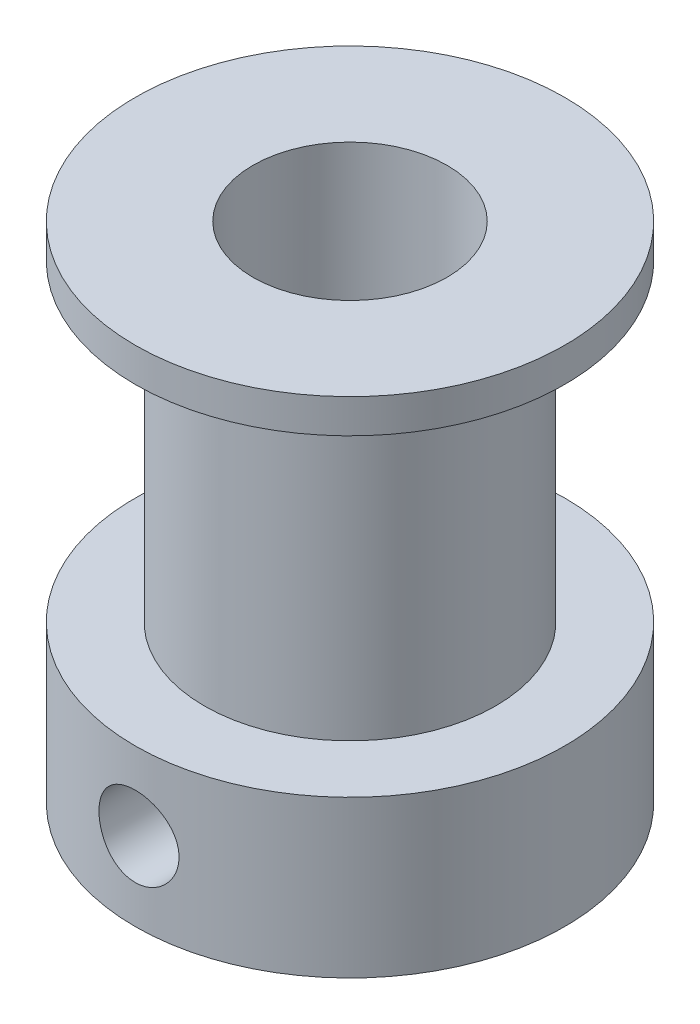
ISO-10303-21;
HEADER;
FILE_DESCRIPTION(('STEP AP214'),'2;1');
FILE_NAME('part.step','',(''),(''),'','','');
FILE_SCHEMA(('AUTOMOTIVE_DESIGN { 1 0 10303 214 1 1 1 1 }'));
ENDSEC;
DATA;
#1=APPLICATION_CONTEXT('core data for automotive mechanical design processes');
#2=APPLICATION_PROTOCOL_DEFINITION('international standard','automotive_design',2000,#1);
#3=PRODUCT_CONTEXT('',#1,'mechanical');
#4=PRODUCT('Part','Part','',(#3));
#5=PRODUCT_RELATED_PRODUCT_CATEGORY('part','',(#4));
#6=PRODUCT_DEFINITION_FORMATION('','',#4);
#7=PRODUCT_DEFINITION_CONTEXT('part definition',#1,'design');
#8=PRODUCT_DEFINITION('design','',#6,#7);
#9=PRODUCT_DEFINITION_SHAPE('','',#8);
#10=(LENGTH_UNIT() NAMED_UNIT(*) SI_UNIT(.MILLI.,.METRE.));
#11=(NAMED_UNIT(*) PLANE_ANGLE_UNIT() SI_UNIT($,.RADIAN.));
#12=(NAMED_UNIT(*) SI_UNIT($,.STERADIAN.) SOLID_ANGLE_UNIT());
#13=UNCERTAINTY_MEASURE_WITH_UNIT(LENGTH_MEASURE(1.E-05),#10,'distance_accuracy_value','');
#14=(GEOMETRIC_REPRESENTATION_CONTEXT(3) GLOBAL_UNCERTAINTY_ASSIGNED_CONTEXT((#13)) GLOBAL_UNIT_ASSIGNED_CONTEXT((#10,
#11,#12)) REPRESENTATION_CONTEXT('',''));
#15=CARTESIAN_POINT('',(0.,0.,0.));
#16=DIRECTION('',(0.,0.,1.));
#17=DIRECTION('',(1.,0.,0.));
#18=AXIS2_PLACEMENT_3D('',#15,#16,#17);
#19=CARTESIAN_POINT('',(0.,6.45,0.));
#20=DIRECTION('',(0.,1.,0.));
#21=DIRECTION('',(0.,0.,1.));
#22=AXIS2_PLACEMENT_3D('',#19,#20,#21);
#23=PLANE('',#22);
#24=CARTESIAN_POINT('',(0.,6.45,0.));
#25=DIRECTION('',(0.,1.,0.));
#26=DIRECTION('',(0.,0.,1.));
#27=AXIS2_PLACEMENT_3D('',#24,#25,#26);
#28=CIRCLE('',#27,8.85);
#29=CARTESIAN_POINT('',(0.,6.45,8.85));
#30=VERTEX_POINT('',#29);
#31=EDGE_CURVE('E10',#30,#30,#28,.T.);
#32=ORIENTED_EDGE('',*,*,#31,.T.);
#33=EDGE_LOOP('',(#32));
#34=FACE_BOUND('',#33,.T.);
#35=CARTESIAN_POINT('',(0.,6.45,0.));
#36=DIRECTION('',(0.,1.,0.));
#37=DIRECTION('',(0.,0.,1.));
#38=AXIS2_PLACEMENT_3D('',#35,#36,#37);
#39=CIRCLE('',#38,6.);
#40=CARTESIAN_POINT('',(0.,6.45,-6.));
#41=VERTEX_POINT('',#40);
#42=EDGE_CURVE('E50',#41,#41,#39,.T.);
#43=ORIENTED_EDGE('',*,*,#42,.F.);
#44=EDGE_LOOP('',(#43));
#45=FACE_BOUND('',#44,.T.);
#46=ADVANCED_FACE('F37',(#34,#45),#23,.T.);
#47=CARTESIAN_POINT('',(0.,6.45,0.));
#48=DIRECTION('',(0.,-1.,0.));
#49=DIRECTION('',(0.,0.,-1.));
#50=AXIS2_PLACEMENT_3D('',#47,#48,#49);
#51=CYLINDRICAL_SURFACE('',#50,8.85);
#52=CARTESIAN_POINT('',(-8.69482604771366,3.225,-1.65000000000002));
#53=CARTESIAN_POINT('',(-8.69482781961837,3.31681287448775,-1.64999646851443));
#54=CARTESIAN_POINT('',(-8.69629608283365,3.40867167900758,-1.64231072640125));
#55=CARTESIAN_POINT('',(-8.70200328524834,3.58979977543449,-1.61179115936412));
#56=CARTESIAN_POINT('',(-8.70624458573472,3.67906679267315,-1.58894442435651));
#57=CARTESIAN_POINT('',(-8.71700118617981,3.85236430882449,-1.52882830359618));
#58=CARTESIAN_POINT('',(-8.72351437901603,3.93639957523533,-1.49157227862261));
#59=CARTESIAN_POINT('',(-8.73807839736241,4.09702149484417,-1.40373041963031));
#60=CARTESIAN_POINT('',(-8.74612910005477,4.17360874226025,-1.35314565020235));
#61=CARTESIAN_POINT('',(-8.76297169239113,4.31810900699174,-1.23941864709532));
#62=CARTESIAN_POINT('',(-8.77177077636014,4.38591705766586,-1.17614408945541));
#63=CARTESIAN_POINT('',(-8.78905513475797,4.51001971125079,-1.03911962454139));
#64=CARTESIAN_POINT('',(-8.79754038866609,4.56631356235852,-0.965369033782184));
#65=CARTESIAN_POINT('',(-8.81331804879978,4.66619163369527,-0.808797051465479));
#66=CARTESIAN_POINT('',(-8.82060099132401,4.70967695400816,-0.725911535870357));
#67=CARTESIAN_POINT('',(-8.83307293463117,4.78206647383251,-0.553852864123928));
#68=CARTESIAN_POINT('',(-8.83826210561995,4.81097185861667,-0.464680219755368));
#69=CARTESIAN_POINT('',(-8.84591101367105,4.85305659356471,-0.283666132693807));
#70=CARTESIAN_POINT('',(-8.84840143451171,4.86641286396068,-0.191867140916775));
#71=CARTESIAN_POINT('',(-8.85047798041754,4.87757143227163,-0.00729976500797));
#72=CARTESIAN_POINT('',(-8.85006435012314,4.87537504035971,0.0854685368106711));
#73=CARTESIAN_POINT('',(-8.84640339377218,4.85562643947166,0.26812807428378));
#74=CARTESIAN_POINT('',(-8.84319122195267,4.83826472463887,0.358040711914525));
#75=CARTESIAN_POINT('',(-8.8343335205522,4.78897952479971,0.533653730977178));
#76=CARTESIAN_POINT('',(-8.82868790303014,4.75705551353121,0.619353960054213));
#77=CARTESIAN_POINT('',(-8.81553884111321,4.67937000374413,0.784662740791317));
#78=CARTESIAN_POINT('',(-8.80802519842167,4.6335322304107,0.864234603406721));
#79=CARTESIAN_POINT('',(-8.7919712231604,4.52937654726323,1.01462834113705));
#80=CARTESIAN_POINT('',(-8.78343078735099,4.47105738203764,1.08544933493525));
#81=CARTESIAN_POINT('',(-8.76611656375867,4.34254428938938,1.2174594850533));
#82=CARTESIAN_POINT('',(-8.75734120124785,4.27218371334684,1.27848631073483));
#83=CARTESIAN_POINT('',(-8.74067002480942,4.12214055531849,1.38789759603455));
#84=CARTESIAN_POINT('',(-8.73277422346778,4.04245783997212,1.43628187475914));
#85=CARTESIAN_POINT('',(-8.71875394667089,3.87581851635431,1.51908012694809));
#86=CARTESIAN_POINT('',(-8.71263243982109,3.78885002785699,1.55347072569812));
#87=CARTESIAN_POINT('',(-8.70289948493759,3.61022963418584,1.60710640444723));
#88=CARTESIAN_POINT('',(-8.69928775595223,3.51857825446165,1.62635317972085));
#89=CARTESIAN_POINT('',(-8.69503880971876,3.33465692674212,1.64891830623663));
#90=CARTESIAN_POINT('',(-8.69435806245767,3.24241655652509,1.65246978029953));
#91=CARTESIAN_POINT('',(-8.69593169929538,3.05866073639462,1.64416820822561));
#92=CARTESIAN_POINT('',(-8.69818593996467,2.96714525127676,1.63231591485339));
#93=CARTESIAN_POINT('',(-8.70533502593781,2.78820201287581,1.59374330856129));
#94=CARTESIAN_POINT('',(-8.71020818991237,2.70074701292193,1.56714501727844));
#95=CARTESIAN_POINT('',(-8.72202738597334,2.53153497214711,1.49996483343461));
#96=CARTESIAN_POINT('',(-8.72897356932747,2.44977834767244,1.45938192038577));
#97=CARTESIAN_POINT('',(-8.74425537945855,2.29325625220904,1.36484721407609));
#98=CARTESIAN_POINT('',(-8.75260596783922,2.21858128300109,1.31074804031415));
#99=CARTESIAN_POINT('',(-8.76971351211558,2.07928490244382,1.1909154151686));
#100=CARTESIAN_POINT('',(-8.7784705040675,2.01466438535008,1.12518093003598));
#101=CARTESIAN_POINT('',(-8.79554392699136,1.8964413592176,0.982902890935281));
#102=CARTESIAN_POINT('',(-8.80385301579686,1.84299556523024,0.906228098094822));
#103=CARTESIAN_POINT('',(-8.81897119598209,1.74974469927004,0.744852397817092));
#104=CARTESIAN_POINT('',(-8.82578034464982,1.70993910629764,0.660151797090438));
#105=CARTESIAN_POINT('',(-8.83709984520675,1.64533367354117,0.485563559444988));
#106=CARTESIAN_POINT('',(-8.8416220090402,1.62045660301217,0.395705300715701));
#107=CARTESIAN_POINT('',(-8.84790837921588,1.58616778576926,0.212993840869887));
#108=CARTESIAN_POINT('',(-8.84967287233642,1.57675443093284,0.120140952198864));
#109=CARTESIAN_POINT('',(-8.85023947633553,1.57371572545131,-0.0644206011572581));
#110=CARTESIAN_POINT('',(-8.8490860170238,1.57985358848999,-0.15612531497475));
#111=CARTESIAN_POINT('',(-8.84403855830965,1.60722483139624,-0.337172528151277));
#112=CARTESIAN_POINT('',(-8.84014458454545,1.62845807004272,-0.426515049601112));
#113=CARTESIAN_POINT('',(-8.83005350199115,1.68531801584082,-0.600178469048794));
#114=CARTESIAN_POINT('',(-8.82386038468533,1.72091978742939,-0.684507777717207));
#115=CARTESIAN_POINT('',(-8.80984173169271,1.80547792675751,-0.8460312366825));
#116=CARTESIAN_POINT('',(-8.80201608830005,1.85443517568985,-0.923224915721277));
#117=CARTESIAN_POINT('',(-8.78545622022546,1.96513091089372,-1.06946650303304));
#118=CARTESIAN_POINT('',(-8.77671069725579,2.02704059416941,-1.1383835614211));
#119=CARTESIAN_POINT('',(-8.75936841281081,2.16152832140757,-1.2649327828544));
#120=CARTESIAN_POINT('',(-8.75077168679307,2.23410887010472,-1.32256228898502));
#121=CARTESIAN_POINT('',(-8.73461461878074,2.38867066634497,-1.42539442795117));
#122=CARTESIAN_POINT('',(-8.72706445726125,2.47073170363209,-1.47047878049901));
#123=CARTESIAN_POINT('',(-8.71397773582027,2.64137713332035,-1.54614967862008));
#124=CARTESIAN_POINT('',(-8.70843927038216,2.72995525644811,-1.57674995216177));
#125=CARTESIAN_POINT('',(-8.7011618261326,2.88649961171443,-1.61634203559836));
#126=CARTESIAN_POINT('',(-8.69879997010431,2.95354754089153,-1.62894221526526));
#127=CARTESIAN_POINT('',(-8.69563144400441,3.08872189687844,-1.64577239651984));
#128=CARTESIAN_POINT('',(-8.69482473244794,3.15684829487026,-1.65000262138364));
#129=CARTESIAN_POINT('',(-8.69482604771366,3.225,-1.65000000000002));
#130=B_SPLINE_CURVE_WITH_KNOTS('',3,(#52,#53,#54,#55,#56,#57,#58,#59,#60,#61,#62,#63,#64,#65,
#66,#67,#68,#69,#70,#71,#72,#73,#74,#75,#76,#77,#78,#79,#80,#81,#82,#83,#84,#85,#86,#87,#88,#89,
#90,#91,#92,#93,#94,#95,#96,#97,#98,#99,#100,#101,#102,#103,#104,#105,#106,#107,#108,#109,#110,
#111,#112,#113,#114,#115,#116,#117,#118,#119,#120,#121,#122,#123,#124,#125,#126,#127,#128,#129),
.UNSPECIFIED.,.T.,.F.,(4,2,2,2,2,2,2,2,2,2,2,2,2,2,2,2,2,2,2,2,2,2,2,2,2,2,2,2,2,2,2,2,2,2,2,2,
2,2,4),(0.,0.275189231168615,0.550613096225518,0.825782188895182,1.10092930997352,
1.37911056598153,1.65730997963981,1.93760432688636,2.21787588399072,2.49492629867896,
2.77195337461801,3.04554991158284,3.31915633674794,3.59429061490545,3.86945257981618,
4.14878682949561,4.42812507576014,4.70792802533318,4.9876996479214,5.2633015385756,
5.53888996138523,5.81223124033559,6.08559246981063,6.3620754969727,6.63858310084262,
6.91874099333438,7.19888818375445,7.47757328709685,7.75622940722651,8.03066822563216,
8.30510447662649,8.57906649708677,8.85304659790226,9.1309069995889,9.40883272690785,
9.68929631029677,9.96949353617283,10.1737689796611,10.3780389738435),.UNSPECIFIED.);
#131=CARTESIAN_POINT('',(-8.69482604771366,3.225,-1.65000000000002));
#132=VERTEX_POINT('',#131);
#133=EDGE_CURVE('E94',#132,#132,#130,.T.);
#134=ORIENTED_EDGE('',*,*,#133,.T.);
#135=EDGE_LOOP('',(#134));
#136=FACE_BOUND('',#135,.T.);
#137=CARTESIAN_POINT('',(-1.64999999999999,3.225,8.69482604771367));
#138=CARTESIAN_POINT('',(-1.6499964685144,3.31681287448775,8.69482781961837));
#139=CARTESIAN_POINT('',(-1.64231072640122,3.40867167900758,8.69629608283366));
#140=CARTESIAN_POINT('',(-1.61179115936409,3.58979977543449,8.70200328524835));
#141=CARTESIAN_POINT('',(-1.58894442435648,3.67906679267315,8.70624458573473));
#142=CARTESIAN_POINT('',(-1.52882830359615,3.85236430882449,8.71700118617981));
#143=CARTESIAN_POINT('',(-1.49157227862258,3.93639957523533,8.72351437901603));
#144=CARTESIAN_POINT('',(-1.40373041963028,4.09702149484417,8.73807839736241));
#145=CARTESIAN_POINT('',(-1.35314565020232,4.17360874226025,8.74612910005477));
#146=CARTESIAN_POINT('',(-1.23941864709529,4.31810900699174,8.76297169239114));
#147=CARTESIAN_POINT('',(-1.17614408945538,4.38591705766586,8.77177077636014));
#148=CARTESIAN_POINT('',(-1.03911962454136,4.51001971125079,8.78905513475797));
#149=CARTESIAN_POINT('',(-0.965369033782153,4.56631356235852,8.7975403886661));
#150=CARTESIAN_POINT('',(-0.808797051465448,4.66619163369527,8.81331804879978));
#151=CARTESIAN_POINT('',(-0.725911535870326,4.70967695400816,8.82060099132401));
#152=CARTESIAN_POINT('',(-0.553852864123897,4.78206647383251,8.83307293463118));
#153=CARTESIAN_POINT('',(-0.464680219755337,4.81097185861667,8.83826210561995));
#154=CARTESIAN_POINT('',(-0.283666132693776,4.85305659356471,8.84591101367105));
#155=CARTESIAN_POINT('',(-0.191867140916744,4.86641286396068,8.84840143451171));
#156=CARTESIAN_POINT('',(-0.00729976500793889,4.87757143227163,8.85047798041754));
#157=CARTESIAN_POINT('',(0.0854685368107021,4.87537504035971,8.85006435012314));
#158=CARTESIAN_POINT('',(0.268128074283811,4.85562643947166,8.84640339377218));
#159=CARTESIAN_POINT('',(0.358040711914556,4.83826472463887,8.84319122195267));
#160=CARTESIAN_POINT('',(0.533653730977209,4.78897952479971,8.8343335205522));
#161=CARTESIAN_POINT('',(0.619353960054244,4.75705551353121,8.82868790303014));
#162=CARTESIAN_POINT('',(0.784662740791348,4.67937000374413,8.81553884111321));
#163=CARTESIAN_POINT('',(0.864234603406751,4.6335322304107,8.80802519842167));
#164=CARTESIAN_POINT('',(1.01462834113708,4.52937654726323,8.7919712231604));
#165=CARTESIAN_POINT('',(1.08544933493528,4.47105738203764,8.78343078735099));
#166=CARTESIAN_POINT('',(1.21745948505333,4.34254428938938,8.76611656375866));
#167=CARTESIAN_POINT('',(1.27848631073486,4.27218371334685,8.75734120124784));
#168=CARTESIAN_POINT('',(1.38789759603458,4.12214055531849,8.74067002480941));
#169=CARTESIAN_POINT('',(1.43628187475917,4.04245783997212,8.73277422346778));
#170=CARTESIAN_POINT('',(1.51908012694812,3.87581851635431,8.71875394667089));
#171=CARTESIAN_POINT('',(1.55347072569815,3.78885002785699,8.71263243982108));
#172=CARTESIAN_POINT('',(1.60710640444726,3.61022963418584,8.70289948493758));
#173=CARTESIAN_POINT('',(1.62635317972088,3.51857825446165,8.69928775595222));
#174=CARTESIAN_POINT('',(1.64891830623666,3.33465692674212,8.69503880971875));
#175=CARTESIAN_POINT('',(1.65246978029956,3.24241655652509,8.69435806245766));
#176=CARTESIAN_POINT('',(1.64416820822564,3.05866073639462,8.69593169929537));
#177=CARTESIAN_POINT('',(1.63231591485342,2.96714525127676,8.69818593996466));
#178=CARTESIAN_POINT('',(1.59374330856132,2.78820201287581,8.7053350259378));
#179=CARTESIAN_POINT('',(1.56714501727847,2.70074701292193,8.71020818991237));
#180=CARTESIAN_POINT('',(1.49996483343464,2.53153497214711,8.72202738597334));
#181=CARTESIAN_POINT('',(1.4593819203858,2.44977834767244,8.72897356932746));
#182=CARTESIAN_POINT('',(1.36484721407612,2.29325625220904,8.74425537945855));
#183=CARTESIAN_POINT('',(1.31074804031418,2.21858128300109,8.75260596783921));
#184=CARTESIAN_POINT('',(1.19091541516863,2.07928490244382,8.76971351211557));
#185=CARTESIAN_POINT('',(1.12518093003601,2.01466438535008,8.77847050406749));
#186=CARTESIAN_POINT('',(0.982902890935312,1.89644135921759,8.79554392699136));
#187=CARTESIAN_POINT('',(0.906228098094853,1.84299556523024,8.80385301579685));
#188=CARTESIAN_POINT('',(0.744852397817122,1.74974469927004,8.81897119598209));
#189=CARTESIAN_POINT('',(0.660151797090468,1.70993910629764,8.82578034464982));
#190=CARTESIAN_POINT('',(0.485563559445018,1.64533367354117,8.83709984520675));
#191=CARTESIAN_POINT('',(0.395705300715731,1.62045660301217,8.84162200904019));
#192=CARTESIAN_POINT('',(0.212993840869917,1.58616778576926,8.84790837921588));
#193=CARTESIAN_POINT('',(0.120140952198894,1.57675443093284,8.84967287233641));
#194=CARTESIAN_POINT('',(-0.0644206011572272,1.57371572545131,8.85023947633553));
#195=CARTESIAN_POINT('',(-0.156125314974719,1.57985358848999,8.8490860170238));
#196=CARTESIAN_POINT('',(-0.337172528151246,1.60722483139624,8.84403855830965));
#197=CARTESIAN_POINT('',(-0.426515049601081,1.62845807004272,8.84014458454545));
#198=CARTESIAN_POINT('',(-0.600178469048764,1.68531801584082,8.83005350199115));
#199=CARTESIAN_POINT('',(-0.684507777717177,1.72091978742939,8.82386038468533));
#200=CARTESIAN_POINT('',(-0.846031236682469,1.80547792675751,8.80984173169271));
#201=CARTESIAN_POINT('',(-0.923224915721247,1.85443517568985,8.80201608830006));
#202=CARTESIAN_POINT('',(-1.06946650303301,1.96513091089372,8.78545622022546));
#203=CARTESIAN_POINT('',(-1.13838356142107,2.02704059416941,8.77671069725579));
#204=CARTESIAN_POINT('',(-1.26493278285437,2.16152832140757,8.75936841281082));
#205=CARTESIAN_POINT('',(-1.32256228898499,2.23410887010472,8.75077168679308));
#206=CARTESIAN_POINT('',(-1.42539442795114,2.38867066634497,8.73461461878074));
#207=CARTESIAN_POINT('',(-1.47047878049898,2.47073170363209,8.72706445726126));
#208=CARTESIAN_POINT('',(-1.54614967862005,2.64137713332034,8.71397773582027));
#209=CARTESIAN_POINT('',(-1.57674995216174,2.72995525644811,8.70843927038216));
#210=CARTESIAN_POINT('',(-1.61634203559833,2.88649961171443,8.7011618261326));
#211=CARTESIAN_POINT('',(-1.62894221526523,2.95354754089153,8.69879997010431));
#212=CARTESIAN_POINT('',(-1.64577239651981,3.08872189687844,8.69563144400442));
#213=CARTESIAN_POINT('',(-1.65000262138361,3.15684829487026,8.69482473244794));
#214=CARTESIAN_POINT('',(-1.64999999999999,3.225,8.69482604771367));
#215=B_SPLINE_CURVE_WITH_KNOTS('',3,(#137,#138,#139,#140,#141,#142,#143,#144,#145,#146,#147,
#148,#149,#150,#151,#152,#153,#154,#155,#156,#157,#158,#159,#160,#161,#162,#163,#164,#165,#166,
#167,#168,#169,#170,#171,#172,#173,#174,#175,#176,#177,#178,#179,#180,#181,#182,#183,#184,#185,
#186,#187,#188,#189,#190,#191,#192,#193,#194,#195,#196,#197,#198,#199,#200,#201,#202,#203,#204,
#205,#206,#207,#208,#209,#210,#211,#212,#213,#214),.UNSPECIFIED.,.T.,.F.,(4,2,2,2,2,2,2,2,2,2,2,
2,2,2,2,2,2,2,2,2,2,2,2,2,2,2,2,2,2,2,2,2,2,2,2,2,2,2,4),(0.,0.275189231168615,
0.550613096225518,0.825782188895182,1.10092930997352,1.37911056598153,1.65730997963981,
1.93760432688636,2.21787588399072,2.49492629867896,2.77195337461801,3.04554991158284,
3.31915633674794,3.59429061490545,3.86945257981617,4.14878682949561,4.42812507576014,
4.70792802533318,4.9876996479214,5.2633015385756,5.53888996138523,5.81223124033559,
6.08559246981063,6.3620754969727,6.63858310084262,6.91874099333439,7.19888818375445,
7.47757328709685,7.75622940722651,8.03066822563216,8.30510447662649,8.57906649708678,
8.85304659790226,9.1309069995889,9.40883272690785,9.68929631029677,9.96949353617283,
10.1737689796611,10.3780389738435),.UNSPECIFIED.);
#216=CARTESIAN_POINT('',(-1.64999999999999,3.225,8.69482604771367));
#217=VERTEX_POINT('',#216);
#218=EDGE_CURVE('E74',#217,#217,#215,.T.);
#219=ORIENTED_EDGE('',*,*,#218,.T.);
#220=EDGE_LOOP('',(#219));
#221=FACE_BOUND('',#220,.T.);
#222=ORIENTED_EDGE('',*,*,#31,.F.);
#223=EDGE_LOOP('',(#222));
#224=FACE_BOUND('',#223,.T.);
#225=CARTESIAN_POINT('',(0.,0.,0.));
#226=DIRECTION('',(0.,1.,0.));
#227=DIRECTION('',(0.,0.,1.));
#228=AXIS2_PLACEMENT_3D('',#225,#226,#227);
#229=CIRCLE('',#228,8.85);
#230=CARTESIAN_POINT('',(0.,0.,8.85));
#231=VERTEX_POINT('',#230);
#232=EDGE_CURVE('E41',#231,#231,#229,.T.);
#233=ORIENTED_EDGE('',*,*,#232,.T.);
#234=EDGE_LOOP('',(#233));
#235=FACE_BOUND('',#234,.T.);
#236=ADVANCED_FACE('F39',(#136,#221,#224,#235),#51,.T.);
#237=CARTESIAN_POINT('',(0.,0.,0.));
#238=DIRECTION('',(0.,1.,0.));
#239=DIRECTION('',(0.,0.,1.));
#240=AXIS2_PLACEMENT_3D('',#237,#238,#239);
#241=PLANE('',#240);
#242=CARTESIAN_POINT('',(0.,0.,0.));
#243=DIRECTION('',(0.,1.,0.));
#244=DIRECTION('',(0.,0.,1.));
#245=AXIS2_PLACEMENT_3D('',#242,#243,#244);
#246=CIRCLE('',#245,4.);
#247=CARTESIAN_POINT('',(0.,0.,4.));
#248=VERTEX_POINT('',#247);
#249=EDGE_CURVE('E59',#248,#248,#246,.T.);
#250=ORIENTED_EDGE('',*,*,#249,.T.);
#251=EDGE_LOOP('',(#250));
#252=FACE_BOUND('',#251,.T.);
#253=ORIENTED_EDGE('',*,*,#232,.F.);
#254=EDGE_LOOP('',(#253));
#255=FACE_BOUND('',#254,.T.);
#256=ADVANCED_FACE('F137',(#252,#255),#241,.F.);
#257=CARTESIAN_POINT('',(0.,19.35,0.));
#258=DIRECTION('',(0.,-1.,0.));
#259=DIRECTION('',(0.,0.,-1.));
#260=AXIS2_PLACEMENT_3D('',#257,#258,#259);
#261=CYLINDRICAL_SURFACE('',#260,6.);
#262=CARTESIAN_POINT('',(0.,19.35,0.));
#263=DIRECTION('',(0.,1.,0.));
#264=DIRECTION('',(0.,0.,1.));
#265=AXIS2_PLACEMENT_3D('',#262,#263,#264);
#266=CIRCLE('',#265,6.);
#267=CARTESIAN_POINT('',(0.,19.35,-6.));
#268=VERTEX_POINT('',#267);
#269=EDGE_CURVE('E48',#268,#268,#266,.T.);
#270=CARTESIAN_POINT('',(0.,19.35,-6.));
#271=CARTESIAN_POINT('',(0.,19.215625,-6.));
#272=CARTESIAN_POINT('',(0.,19.08125,-6.));
#273=CARTESIAN_POINT('',(0.,18.8125,-6.));
#274=CARTESIAN_POINT('',(0.,18.678125,-6.));
#275=CARTESIAN_POINT('',(0.,18.409375,-6.));
#276=CARTESIAN_POINT('',(0.,18.275,-6.));
#277=CARTESIAN_POINT('',(0.,18.00625,-6.));
#278=CARTESIAN_POINT('',(0.,17.871875,-6.));
#279=CARTESIAN_POINT('',(0.,17.603125,-6.));
#280=CARTESIAN_POINT('',(0.,17.46875,-6.));
#281=CARTESIAN_POINT('',(0.,17.2,-6.));
#282=CARTESIAN_POINT('',(0.,17.065625,-6.));
#283=CARTESIAN_POINT('',(0.,16.796875,-6.));
#284=CARTESIAN_POINT('',(0.,16.6625,-6.));
#285=CARTESIAN_POINT('',(0.,16.39375,-6.));
#286=CARTESIAN_POINT('',(0.,16.259375,-6.));
#287=CARTESIAN_POINT('',(0.,15.990625,-6.));
#288=CARTESIAN_POINT('',(0.,15.85625,-6.));
#289=CARTESIAN_POINT('',(0.,15.5875,-6.));
#290=CARTESIAN_POINT('',(0.,15.453125,-6.));
#291=CARTESIAN_POINT('',(0.,15.184375,-6.));
#292=CARTESIAN_POINT('',(0.,15.05,-6.));
#293=CARTESIAN_POINT('',(0.,14.78125,-6.));
#294=CARTESIAN_POINT('',(0.,14.646875,-6.));
#295=CARTESIAN_POINT('',(0.,14.378125,-6.));
#296=CARTESIAN_POINT('',(0.,14.24375,-6.));
#297=CARTESIAN_POINT('',(0.,13.975,-6.));
#298=CARTESIAN_POINT('',(0.,13.840625,-6.));
#299=CARTESIAN_POINT('',(0.,13.571875,-6.));
#300=CARTESIAN_POINT('',(0.,13.4375,-6.));
#301=CARTESIAN_POINT('',(0.,13.16875,-6.));
#302=CARTESIAN_POINT('',(0.,13.034375,-6.));
#303=CARTESIAN_POINT('',(0.,12.765625,-6.));
#304=CARTESIAN_POINT('',(0.,12.63125,-6.));
#305=CARTESIAN_POINT('',(0.,12.3625,-6.));
#306=CARTESIAN_POINT('',(0.,12.228125,-6.));
#307=CARTESIAN_POINT('',(0.,11.959375,-6.));
#308=CARTESIAN_POINT('',(0.,11.825,-6.));
#309=CARTESIAN_POINT('',(0.,11.55625,-6.));
#310=CARTESIAN_POINT('',(0.,11.421875,-6.));
#311=CARTESIAN_POINT('',(0.,11.153125,-6.));
#312=CARTESIAN_POINT('',(0.,11.01875,-6.));
#313=CARTESIAN_POINT('',(0.,10.75,-6.));
#314=CARTESIAN_POINT('',(0.,10.615625,-6.));
#315=CARTESIAN_POINT('',(0.,10.346875,-6.));
#316=CARTESIAN_POINT('',(0.,10.2125,-6.));
#317=CARTESIAN_POINT('',(0.,9.94375,-6.));
#318=CARTESIAN_POINT('',(0.,9.809375,-6.));
#319=CARTESIAN_POINT('',(0.,9.540625,-6.));
#320=CARTESIAN_POINT('',(0.,9.40625,-6.));
#321=CARTESIAN_POINT('',(0.,9.1375,-6.));
#322=CARTESIAN_POINT('',(0.,9.003125,-6.));
#323=CARTESIAN_POINT('',(0.,8.734375,-6.));
#324=CARTESIAN_POINT('',(0.,8.6,-6.));
#325=CARTESIAN_POINT('',(0.,8.33125,-6.));
#326=CARTESIAN_POINT('',(0.,8.196875,-6.));
#327=CARTESIAN_POINT('',(0.,7.928125,-6.));
#328=CARTESIAN_POINT('',(0.,7.79375,-6.));
#329=CARTESIAN_POINT('',(0.,7.525,-6.));
#330=CARTESIAN_POINT('',(0.,7.390625,-6.));
#331=CARTESIAN_POINT('',(0.,7.121875,-6.));
#332=CARTESIAN_POINT('',(0.,6.9875,-6.));
#333=CARTESIAN_POINT('',(0.,6.71875,-6.));
#334=CARTESIAN_POINT('',(0.,6.584375,-6.));
#335=CARTESIAN_POINT('',(0.,6.45,-6.));
#336=B_SPLINE_CURVE_WITH_KNOTS('',3,(#270,#271,#272,#273,#274,#275,#276,#277,#278,#279,#280,
#281,#282,#283,#284,#285,#286,#287,#288,#289,#290,#291,#292,#293,#294,#295,#296,#297,#298,#299,
#300,#301,#302,#303,#304,#305,#306,#307,#308,#309,#310,#311,#312,#313,#314,#315,#316,#317,#318,
#319,#320,#321,#322,#323,#324,#325,#326,#327,#328,#329,#330,#331,#332,#333,#334,#335),
.UNSPECIFIED.,.F.,.F.,(4,2,2,2,2,2,2,2,2,2,2,2,2,2,2,2,2,2,2,2,2,2,2,2,2,2,2,2,2,2,2,2,4),(0.,
0.403125000000001,0.806250000000001,1.209375,1.6125,2.015625,2.41875,2.821875,3.225,3.628125,
4.03125,4.434375,4.8375,5.240625,5.64375,6.046875,6.45,6.853125,7.25625,7.659375,8.0625,
8.465625,8.86875,9.271875,9.675,10.078125,10.48125,10.884375,11.2875,11.690625,12.09375,
12.496875,12.9),.UNSPECIFIED.);
#337=EDGE_CURVE('BSEAM131',#268,#41,#336,.T.);
#338=ORIENTED_EDGE('',*,*,#269,.F.);
#339=ORIENTED_EDGE('',*,*,#42,.T.);
#340=ORIENTED_EDGE('',*,*,#337,.T.);
#341=ORIENTED_EDGE('',*,*,#337,.F.);
#342=EDGE_LOOP('',(#338,#340,#339,#341));
#343=FACE_BOUND('',#342,.T.);
#344=ADVANCED_FACE('F131',(#343),#261,.T.);
#345=CARTESIAN_POINT('',(0.,19.35,0.));
#346=DIRECTION('',(0.,1.,0.));
#347=DIRECTION('',(0.,0.,1.));
#348=AXIS2_PLACEMENT_3D('',#345,#346,#347);
#349=PLANE('',#348);
#350=CARTESIAN_POINT('',(0.,19.35,0.));
#351=DIRECTION('',(0.,1.,0.));
#352=DIRECTION('',(0.,0.,1.));
#353=AXIS2_PLACEMENT_3D('',#350,#351,#352);
#354=CIRCLE('',#353,8.85);
#355=CARTESIAN_POINT('',(0.,19.35,8.85));
#356=VERTEX_POINT('',#355);
#357=EDGE_CURVE('E56',#356,#356,#354,.T.);
#358=ORIENTED_EDGE('',*,*,#357,.F.);
#359=EDGE_LOOP('',(#358));
#360=FACE_BOUND('',#359,.T.);
#361=ORIENTED_EDGE('',*,*,#269,.T.);
#362=EDGE_LOOP('',(#361));
#363=FACE_BOUND('',#362,.T.);
#364=ADVANCED_FACE('F125',(#360,#363),#349,.F.);
#365=CARTESIAN_POINT('',(0.,20.75,0.));
#366=DIRECTION('',(0.,-1.,0.));
#367=DIRECTION('',(0.,0.,-1.));
#368=AXIS2_PLACEMENT_3D('',#365,#366,#367);
#369=CYLINDRICAL_SURFACE('',#368,8.85);
#370=CARTESIAN_POINT('',(0.,20.75,0.));
#371=DIRECTION('',(0.,1.,0.));
#372=DIRECTION('',(0.,0.,1.));
#373=AXIS2_PLACEMENT_3D('',#370,#371,#372);
#374=CIRCLE('',#373,8.85);
#375=CARTESIAN_POINT('',(0.,20.75,8.85));
#376=VERTEX_POINT('',#375);
#377=EDGE_CURVE('E53',#376,#376,#374,.T.);
#378=ORIENTED_EDGE('',*,*,#377,.F.);
#379=EDGE_LOOP('',(#378));
#380=FACE_BOUND('',#379,.T.);
#381=ORIENTED_EDGE('',*,*,#357,.T.);
#382=EDGE_LOOP('',(#381));
#383=FACE_BOUND('',#382,.T.);
#384=ADVANCED_FACE('F120',(#380,#383),#369,.T.);
#385=CARTESIAN_POINT('',(0.,20.75,0.));
#386=DIRECTION('',(0.,1.,0.));
#387=DIRECTION('',(0.,0.,1.));
#388=AXIS2_PLACEMENT_3D('',#385,#386,#387);
#389=PLANE('',#388);
#390=CARTESIAN_POINT('',(0.,20.75,0.));
#391=DIRECTION('',(0.,1.,0.));
#392=DIRECTION('',(0.,0.,1.));
#393=AXIS2_PLACEMENT_3D('',#390,#391,#392);
#394=CIRCLE('',#393,4.);
#395=CARTESIAN_POINT('',(0.,20.75,4.));
#396=VERTEX_POINT('',#395);
#397=EDGE_CURVE('E62',#396,#396,#394,.T.);
#398=ORIENTED_EDGE('',*,*,#397,.F.);
#399=EDGE_LOOP('',(#398));
#400=FACE_BOUND('',#399,.T.);
#401=ORIENTED_EDGE('',*,*,#377,.T.);
#402=EDGE_LOOP('',(#401));
#403=FACE_BOUND('',#402,.T.);
#404=ADVANCED_FACE('F113',(#400,#403),#389,.T.);
#405=CARTESIAN_POINT('',(0.,0.,0.));
#406=DIRECTION('',(0.,1.,0.));
#407=DIRECTION('',(0.,0.,1.));
#408=AXIS2_PLACEMENT_3D('',#405,#406,#407);
#409=CYLINDRICAL_SURFACE('',#408,4.);
#410=CARTESIAN_POINT('',(-3.64383040220041,3.225,-1.65000000000001));
#411=CARTESIAN_POINT('',(-3.64383945275153,3.13690351977432,-1.64999056813103));
#412=CARTESIAN_POINT('',(-3.64707173267573,3.04865956802641,-1.64289989177359));
#413=CARTESIAN_POINT('',(-3.65959209124687,2.87471293892112,-1.61480845546374));
#414=CARTESIAN_POINT('',(-3.66889676295874,2.7890178994024,-1.5937695789634));
#415=CARTESIAN_POINT('',(-3.69231325052125,2.62299706186937,-1.53873536249639));
#416=CARTESIAN_POINT('',(-3.70640571161012,2.54265117978141,-1.50479212400174));
#417=CARTESIAN_POINT('',(-3.73778230052357,2.38881823316578,-1.42506535594207));
#418=CARTESIAN_POINT('',(-3.75506562873472,2.31532945721597,-1.37928479159596));
#419=CARTESIAN_POINT('',(-3.7920553041855,2.1727713121535,-1.27419856290372));
#420=CARTESIAN_POINT('',(-3.81184277704779,2.1041707442198,-1.2142851824136));
#421=CARTESIAN_POINT('',(-3.85094363418238,1.97764522809125,-1.08391072165483));
#422=CARTESIAN_POINT('',(-3.87025683535296,1.91972434852778,-1.01344563996365));
#423=CARTESIAN_POINT('',(-3.90721575035942,1.81382862869814,-0.860301943593391));
#424=CARTESIAN_POINT('',(-3.92475616703247,1.76637906729385,-0.7772323901136));
#425=CARTESIAN_POINT('',(-3.95520283117798,1.6863298546783,-0.603436361875867));
#426=CARTESIAN_POINT('',(-3.96811109652272,1.65372373565344,-0.512713242513055));
#427=CARTESIAN_POINT('',(-3.98726403378776,1.60597929334378,-0.331105172304409));
#428=CARTESIAN_POINT('',(-3.99381564337609,1.59003315207677,-0.240465625184504));
#429=CARTESIAN_POINT('',(-4.0006306156112,1.57345334814483,-0.0575763551498775));
#430=CARTESIAN_POINT('',(-4.00089647540932,1.572813604678,0.0346727137709425));
#431=CARTESIAN_POINT('',(-3.99529224160632,1.5864364961366,0.212297380895972));
#432=CARTESIAN_POINT('',(-3.98978733384659,1.59981218371711,0.297754665400383));
#433=CARTESIAN_POINT('',(-3.97375926025945,1.63956881744776,0.465085845235265));
#434=CARTESIAN_POINT('',(-3.96323572489497,1.66595072129069,0.546959476205478));
#435=CARTESIAN_POINT('',(-3.93798907731603,1.73128766172019,0.706295606817215));
#436=CARTESIAN_POINT('',(-3.92320447216363,1.77042798992488,0.783671979762454));
#437=CARTESIAN_POINT('',(-3.89088763760773,1.85999127918661,0.930960489992451));
#438=CARTESIAN_POINT('',(-3.87335444442337,1.91041820050331,1.0008699945393));
#439=CARTESIAN_POINT('',(-3.83587133640028,2.02518823902864,1.13638530947039));
#440=CARTESIAN_POINT('',(-3.8158381454309,2.09025341089873,1.20135746318643));
#441=CARTESIAN_POINT('',(-3.77653142784556,2.23040966632158,1.31973838423492));
#442=CARTESIAN_POINT('',(-3.75725818494774,2.3055044492633,1.373142865722));
#443=CARTESIAN_POINT('',(-3.7210660715691,2.46659840354732,1.46845339844826));
#444=CARTESIAN_POINT('',(-3.70424107982559,2.55286757169265,1.50994179309275));
#445=CARTESIAN_POINT('',(-3.67596385006486,2.7320466714059,1.57754508127094));
#446=CARTESIAN_POINT('',(-3.66450786071418,2.82495191387382,1.60367071206119));
#447=CARTESIAN_POINT('',(-3.64919091711419,3.00842289518499,1.6382132035594));
#448=CARTESIAN_POINT('',(-3.64489111171832,3.09875830118286,1.6476556945468));
#449=CARTESIAN_POINT('',(-3.64311980380968,3.2798056296986,1.65157101672825));
#450=CARTESIAN_POINT('',(-3.6456460160745,3.37051741605928,1.646048857804));
#451=CARTESIAN_POINT('',(-3.65678944366162,3.54380100904947,1.62112710501825));
#452=CARTESIAN_POINT('',(-3.66501803861665,3.62652817967461,1.60261202118541));
#453=CARTESIAN_POINT('',(-3.68614612916708,3.78763706437997,1.55339580262013));
#454=CARTESIAN_POINT('',(-3.69904670212357,3.86601777135166,1.52269185697121));
#455=CARTESIAN_POINT('',(-3.72872477858183,4.01987900569564,1.44853902204983));
#456=CARTESIAN_POINT('',(-3.74564214050946,4.09510019477924,1.40460979308262));
#457=CARTESIAN_POINT('',(-3.78124523189864,4.23746016942973,1.30573455409449));
#458=CARTESIAN_POINT('',(-3.79993171387674,4.30459548773512,1.25078384473682));
#459=CARTESIAN_POINT('',(-3.83876011670653,4.43442962644671,1.12627542162097));
#460=CARTESIAN_POINT('',(-3.85889967217623,4.49635173704872,1.05590387126702));
#461=CARTESIAN_POINT('',(-3.89698114804695,4.60764285566206,0.905297980080086));
#462=CARTESIAN_POINT('',(-3.91492292631237,4.65701105200319,0.825063002026887));
#463=CARTESIAN_POINT('',(-3.94668767391886,4.74170413420678,0.656516816883251));
#464=CARTESIAN_POINT('',(-3.96050313975064,4.77700347500272,0.568191273870476));
#465=CARTESIAN_POINT('',(-3.98237104121022,4.83199165685874,0.386140833605162));
#466=CARTESIAN_POINT('',(-3.9904268305481,4.85168958293893,0.292419112817546));
#467=CARTESIAN_POINT('',(-3.9994889299446,4.87378822892048,0.109187189544821));
#468=CARTESIAN_POINT('',(-4.00094173424749,4.87728482874193,0.0198303081186212));
#469=CARTESIAN_POINT('',(-3.99786220239438,4.86981456562971,-0.158161739195425));
#470=CARTESIAN_POINT('',(-3.99333087896147,4.85885015000454,-0.246797024648493));
#471=CARTESIAN_POINT('',(-3.979024148364,4.82355535786443,-0.417705375935888));
#472=CARTESIAN_POINT('',(-3.96943363922013,4.79969555788544,-0.500092371627863));
#473=CARTESIAN_POINT('',(-3.94605480923815,4.73979588512,-0.659667355734171));
#474=CARTESIAN_POINT('',(-3.93226568297162,4.70375367521331,-0.736854343148755));
#475=CARTESIAN_POINT('',(-3.90105808483759,4.61869547331361,-0.88766113373263));
#476=CARTESIAN_POINT('',(-3.88350423911689,4.56916874322707,-0.960964214361161));
#477=CARTESIAN_POINT('',(-3.84685709666619,4.45929715321,-1.09852932170706));
#478=CARTESIAN_POINT('',(-3.82776324400832,4.39894837691919,-1.16278806031651));
#479=CARTESIAN_POINT('',(-3.78859741195737,4.26441247264534,-1.28487769945048));
#480=CARTESIAN_POINT('',(-3.76854475207571,4.18957224311506,-1.34199767947158));
#481=CARTESIAN_POINT('',(-3.73105419200533,4.03073402431893,-1.44296474677331));
#482=CARTESIAN_POINT('',(-3.71361773967119,3.94673100829041,-1.48680449811904));
#483=CARTESIAN_POINT('',(-3.68370387904713,3.7722715587301,-1.55944447766652));
#484=CARTESIAN_POINT('',(-3.67119480418033,3.6818608919089,-1.58834112875234));
#485=CARTESIAN_POINT('',(-3.65281837075146,3.49695285592164,-1.63017263567573));
#486=CARTESIAN_POINT('',(-3.64692873900432,3.40247030912313,-1.64316103312975));
#487=CARTESIAN_POINT('',(-3.64414054419779,3.28013668635736,-1.6493120932942));
#488=CARTESIAN_POINT('',(-3.64382756923722,3.25257556771498,-1.65000295232161));
#489=CARTESIAN_POINT('',(-3.64383040220041,3.225,-1.65000000000001));
#490=B_SPLINE_CURVE_WITH_KNOTS('',3,(#410,#411,#412,#413,#414,#415,#416,#417,#418,#419,#420,
#421,#422,#423,#424,#425,#426,#427,#428,#429,#430,#431,#432,#433,#434,#435,#436,#437,#438,#439,
#440,#441,#442,#443,#444,#445,#446,#447,#448,#449,#450,#451,#452,#453,#454,#455,#456,#457,#458,
#459,#460,#461,#462,#463,#464,#465,#466,#467,#468,#469,#470,#471,#472,#473,#474,#475,#476,#477,
#478,#479,#480,#481,#482,#483,#484,#485,#486,#487,#488,#489),.UNSPECIFIED.,.T.,.F.,(4,2,2,2,2,2,
2,2,2,2,2,2,2,2,2,2,2,2,2,2,2,2,2,2,2,2,2,2,2,2,2,2,2,2,2,2,2,2,2,4),(0.,0.264211724660743,
0.529148459018596,0.793026677872046,1.05683885985755,1.33523297260791,1.61373292676209,
1.90403076094907,2.19420198072698,2.46953816244269,2.74476495901023,3.00356896819765,
3.2623920368679,3.52515526924738,3.78801084539544,4.06907613148063,4.35024537535723,
4.64031806272421,4.93018777241109,5.20152035698261,5.4727621157604,5.72713321026164,
5.98156300028878,6.24665916965706,6.51186861189121,6.79815687284344,7.08446363898861,
7.37128791456168,7.65794504349148,7.92489841526076,8.19180661499932,8.44957452423756,
8.70739191275385,8.97680852354691,9.24632283025303,9.53374725602172,9.82133016535512,
10.1070334851925,10.3917725616093,10.4744749384331),.UNSPECIFIED.);
#491=CARTESIAN_POINT('',(-3.64383040220041,3.225,-1.65000000000001));
#492=VERTEX_POINT('',#491);
#493=EDGE_CURVE('E98',#492,#492,#490,.T.);
#494=ORIENTED_EDGE('',*,*,#493,.T.);
#495=EDGE_LOOP('',(#494));
#496=FACE_BOUND('',#495,.T.);
#497=CARTESIAN_POINT('',(0.,1.57500000000001,4.));
#498=CARTESIAN_POINT('',(0.0884596783632786,1.57500921720664,3.99999309817074));
#499=CARTESIAN_POINT('',(0.177062252057582,1.58215601434332,3.99703145792172));
#500=CARTESIAN_POINT('',(0.351759669836408,1.6104911419369,3.9854711320255));
#501=CARTESIAN_POINT('',(0.437847271996959,1.63171651102432,3.97685757767606));
#502=CARTESIAN_POINT('',(0.604702496902739,1.6872948122019,3.95491965529936));
#503=CARTESIAN_POINT('',(0.685486934491194,1.72160364335346,3.94161112398211));
#504=CARTESIAN_POINT('',(0.840076633223485,1.80219475784943,3.91158286286531));
#505=CARTESIAN_POINT('',(0.913884076117564,1.84847328117016,3.89486420463244));
#506=CARTESIAN_POINT('',(1.05618769598525,1.95410675464405,3.85876900012149));
#507=CARTESIAN_POINT('',(1.12429373957476,2.01395767024898,3.83930654387258));
#508=CARTESIAN_POINT('',(1.24983574384757,2.14398883965898,3.80029483347099));
#509=CARTESIAN_POINT('',(1.30726618926957,2.21417439921181,3.78074553976622));
#510=CARTESIAN_POINT('',(1.41254826809049,2.36696824887172,3.74272551686067));
#511=CARTESIAN_POINT('',(1.45980781790561,2.45001111530653,3.72435159658093));
#512=CARTESIAN_POINT('',(1.53951358199406,2.62373630929018,3.69212136090386));
#513=CARTESIAN_POINT('',(1.5719672771279,2.71441475136301,3.67826276509115));
#514=CARTESIAN_POINT('',(1.61953738222492,2.89634799700183,3.65756021871623));
#515=CARTESIAN_POINT('',(1.63540371417153,2.98737107214307,3.65041449103236));
#516=CARTESIAN_POINT('',(1.65168918120802,3.17104650736528,3.64307714795703));
#517=CARTESIAN_POINT('',(1.65211659474,3.26369796762931,3.64288180572738));
#518=CARTESIAN_POINT('',(1.6380778077983,3.44059888661872,3.64921138579605));
#519=CARTESIAN_POINT('',(1.62472398487458,3.52495815874916,3.6552343974104));
#520=CARTESIAN_POINT('',(1.58536484231197,3.69011028438117,3.67247532251837));
#521=CARTESIAN_POINT('',(1.55935715587184,3.7709024676033,3.68369420783859));
#522=CARTESIAN_POINT('',(1.49492412942488,3.92864510875862,3.71031458481431));
#523=CARTESIAN_POINT('',(1.45624866973016,4.00547873780833,3.72579923184191));
#524=CARTESIAN_POINT('',(1.36775445443624,4.15186023246004,3.75918616236907));
#525=CARTESIAN_POINT('',(1.31793135478159,4.22140524224915,3.77708938726885));
#526=CARTESIAN_POINT('',(1.20371911924869,4.35728640778781,3.81509742396095));
#527=CARTESIAN_POINT('',(1.13846630094388,4.42288195770325,3.8352618825369));
#528=CARTESIAN_POINT('',(0.997682554866211,4.54244467444137,3.87426910607353));
#529=CARTESIAN_POINT('',(0.922149319847429,4.59640922386084,3.8931115728953));
#530=CARTESIAN_POINT('',(0.760736369737321,4.69223477358503,3.92787932271737));
#531=CARTESIAN_POINT('',(0.674664094072233,4.73380028319417,3.94373050716791));
#532=CARTESIAN_POINT('',(0.495928253552974,4.80160302410887,3.97016319816605));
#533=CARTESIAN_POINT('',(0.403268287372383,4.82784855321116,3.98074755693754));
#534=CARTESIAN_POINT('',(0.220181304317671,4.86272950367822,3.99492450637935));
#535=CARTESIAN_POINT('',(0.12997417230822,4.87235917793593,3.99891121146315));
#536=CARTESIAN_POINT('',(-0.0508474401522236,4.87669204376329,4.00069746426785));
#537=CARTESIAN_POINT('',(-0.141461799500567,4.87139941310821,3.99849874371343));
#538=CARTESIAN_POINT('',(-0.315907755487549,4.84675473175704,3.98841747083847));
#539=CARTESIAN_POINT('',(-0.399855317526685,4.8280959266599,3.9808153168881));
#540=CARTESIAN_POINT('',(-0.563340473329575,4.77820790366289,3.96098887803091));
#541=CARTESIAN_POINT('',(-0.642877505872146,4.7469770901852,3.94876400644332));
#542=CARTESIAN_POINT('',(-0.798061975964474,4.6718106200191,3.92039728883464));
#543=CARTESIAN_POINT('',(-0.873512656660505,4.62751143824378,3.90414585630856));
#544=CARTESIAN_POINT('',(-1.01617847320907,4.52786606574213,3.86946768187548));
#545=CARTESIAN_POINT('',(-1.0833901834211,4.47251530491016,3.85104004134398));
#546=CARTESIAN_POINT('',(-1.21261994292741,4.34779569518802,3.8124029584454));
#547=CARTESIAN_POINT('',(-1.27394364561822,4.2777161759607,3.79215916493832));
#548=CARTESIAN_POINT('',(-1.38414835482505,4.12792870939147,3.75333928940831));
#549=CARTESIAN_POINT('',(-1.43302674162727,4.04821874005744,3.73476355904109));
#550=CARTESIAN_POINT('',(-1.51742282291387,3.87990462946668,3.70128700339843));
#551=CARTESIAN_POINT('',(-1.55275802936534,3.79119808399194,3.68643724424496));
#552=CARTESIAN_POINT('',(-1.60769618165393,3.60829083402175,3.66281640168181));
#553=CARTESIAN_POINT('',(-1.62731175174752,3.51409460358182,3.65404044124936));
#554=CARTESIAN_POINT('',(-1.64901123940267,3.33056972684193,3.64429559365239));
#555=CARTESIAN_POINT('',(-1.65231049364124,3.24141278054206,3.64278573581524));
#556=CARTESIAN_POINT('',(-1.64451485356567,3.06387152924082,3.64631178238903));
#557=CARTESIAN_POINT('',(-1.63342206561729,2.97548711308063,3.65134672892697));
#558=CARTESIAN_POINT('',(-1.59817118006571,2.8060669287423,3.666904904187));
#559=CARTESIAN_POINT('',(-1.57461958437453,2.72487928857789,3.67717261200251));
#560=CARTESIAN_POINT('',(-1.51570599472927,2.56758547752592,3.70184411206584));
#561=CARTESIAN_POINT('',(-1.48034069596892,2.49148073570239,3.71624906152171));
#562=CARTESIAN_POINT('',(-1.3963806225379,2.3415779617586,3.7486340889516));
#563=CARTESIAN_POINT('',(-1.3471244359927,2.26818592897859,3.76677577854003));
#564=CARTESIAN_POINT('',(-1.23771718137822,2.13032831273572,3.80412864636709));
#565=CARTESIAN_POINT('',(-1.17756245772961,2.06586573722558,3.82334018195057));
#566=CARTESIAN_POINT('',(-1.04300738755743,1.94300586129633,3.86230172013188));
#567=CARTESIAN_POINT('',(-0.967900110730172,1.88536077639448,3.88199359359226));
#568=CARTESIAN_POINT('',(-0.80834346318203,1.78345984046129,3.91832426905579));
#569=CARTESIAN_POINT('',(-0.723889843442847,1.73921011363411,3.9349616732268));
#570=CARTESIAN_POINT('',(-0.549414760109624,1.66633626016526,3.96305691394126));
#571=CARTESIAN_POINT('',(-0.459513381649422,1.63745757464146,3.97459855421812));
#572=CARTESIAN_POINT('',(-0.275719229213239,1.59548891521486,3.99154438775475));
#573=CARTESIAN_POINT('',(-0.181839966818027,1.58234933375456,3.99696786149576));
#574=CARTESIAN_POINT('',(-0.0584442952271949,1.57577322966997,3.99968194626838));
#575=CARTESIAN_POINT('',(-0.0292299486703373,1.57499695433579,4.00000228058838));
#576=CARTESIAN_POINT('',(0.,1.57500000000001,4.));
#577=B_SPLINE_CURVE_WITH_KNOTS('',3,(#497,#498,#499,#500,#501,#502,#503,#504,#505,#506,#507,
#508,#509,#510,#511,#512,#513,#514,#515,#516,#517,#518,#519,#520,#521,#522,#523,#524,#525,#526,
#527,#528,#529,#530,#531,#532,#533,#534,#535,#536,#537,#538,#539,#540,#541,#542,#543,#544,#545,
#546,#547,#548,#549,#550,#551,#552,#553,#554,#555,#556,#557,#558,#559,#560,#561,#562,#563,#564,
#565,#566,#567,#568,#569,#570,#571,#572,#573,#574,#575,#576),.UNSPECIFIED.,.T.,.F.,(4,2,2,2,2,2,
2,2,2,2,2,2,2,2,2,2,2,2,2,2,2,2,2,2,2,2,2,2,2,2,2,2,2,2,2,2,2,2,2,4),(0.,0.265297098770619,
0.531294937906659,0.796403981498879,1.06142984766523,1.33841878994456,1.61555043582129,
1.90598404924537,2.19627075414924,2.4727764853942,2.74913395037959,3.00480633611682,
3.2605265616686,3.5216353930134,3.78284615202014,4.06565185095455,4.34852112528508,
4.63767392136375,4.92666995726766,5.19768149557685,5.46861716672804,5.72643264660553,
5.98428085748383,6.25011488704505,6.51605907418431,6.80064580250401,7.08529238632157,
7.3736498522578,7.66177550895674,7.92807823226722,8.19434198489783,8.44869772098557,
8.70312467109943,8.97267479984707,9.24231550885211,9.53104085816539,9.81989801073176,
10.1038095613048,10.3868238858898,10.4744866574817),.UNSPECIFIED.);
#578=CARTESIAN_POINT('',(0.,1.57500000000001,4.));
#579=VERTEX_POINT('',#578);
#580=EDGE_CURVE('E65',#579,#579,#577,.T.);
#581=ORIENTED_EDGE('',*,*,#580,.T.);
#582=EDGE_LOOP('',(#581));
#583=FACE_BOUND('',#582,.T.);
#584=ORIENTED_EDGE('',*,*,#249,.F.);
#585=EDGE_LOOP('',(#584));
#586=FACE_BOUND('',#585,.T.);
#587=ORIENTED_EDGE('',*,*,#397,.T.);
#588=EDGE_LOOP('',(#587));
#589=FACE_BOUND('',#588,.T.);
#590=ADVANCED_FACE('F79',(#496,#583,#586,#589),#409,.F.);
#591=CARTESIAN_POINT('',(0.,3.225,0.));
#592=DIRECTION('',(0.,0.,-1.));
#593=DIRECTION('',(-1.,0.,0.));
#594=AXIS2_PLACEMENT_3D('',#591,#592,#593);
#595=CYLINDRICAL_SURFACE('',#594,1.64999999999999);
#596=ORIENTED_EDGE('',*,*,#218,.F.);
#597=EDGE_LOOP('',(#596));
#598=FACE_BOUND('',#597,.T.);
#599=ORIENTED_EDGE('',*,*,#580,.F.);
#600=EDGE_LOOP('',(#599));
#601=FACE_BOUND('',#600,.T.);
#602=ADVANCED_FACE('F82',(#598,#601),#595,.F.);
#603=CARTESIAN_POINT('',(0.,3.225,0.));
#604=DIRECTION('',(1.,0.,0.));
#605=DIRECTION('',(0.,0.,-1.));
#606=AXIS2_PLACEMENT_3D('',#603,#604,#605);
#607=CYLINDRICAL_SURFACE('',#606,1.64999999999999);
#608=ORIENTED_EDGE('',*,*,#133,.F.);
#609=EDGE_LOOP('',(#608));
#610=FACE_BOUND('',#609,.T.);
#611=ORIENTED_EDGE('',*,*,#493,.F.);
#612=EDGE_LOOP('',(#611));
#613=FACE_BOUND('',#612,.T.);
#614=ADVANCED_FACE('F86',(#610,#613),#607,.F.);
#615=CLOSED_SHELL('',(#46,#236,#256,#344,#364,#384,#404,#590,#602,#614));
#616=MANIFOLD_SOLID_BREP('B2',#615);
#617=ADVANCED_BREP_SHAPE_REPRESENTATION('',(#18,#616),#14);
#618=SHAPE_DEFINITION_REPRESENTATION(#9,#617);
ENDSEC;
END-ISO-10303-21;
